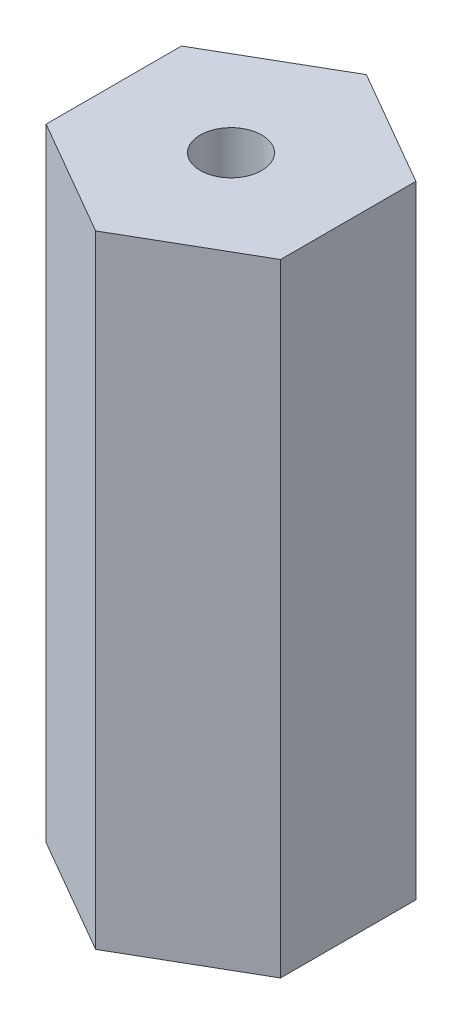
ISO-10303-21;
HEADER;
FILE_DESCRIPTION(('STEP AP214'),'2;1');
FILE_NAME('part.step','',(''),(''),'','','');
FILE_SCHEMA(('AUTOMOTIVE_DESIGN { 1 0 10303 214 1 1 1 1 }'));
ENDSEC;
DATA;
#1=APPLICATION_CONTEXT('core data for automotive mechanical design processes');
#2=APPLICATION_PROTOCOL_DEFINITION('international standard','automotive_design',2000,#1);
#3=PRODUCT_CONTEXT('',#1,'mechanical');
#4=PRODUCT('Part','Part','',(#3));
#5=PRODUCT_RELATED_PRODUCT_CATEGORY('part','',(#4));
#6=PRODUCT_DEFINITION_FORMATION('','',#4);
#7=PRODUCT_DEFINITION_CONTEXT('part definition',#1,'design');
#8=PRODUCT_DEFINITION('design','',#6,#7);
#9=PRODUCT_DEFINITION_SHAPE('','',#8);
#10=(LENGTH_UNIT() NAMED_UNIT(*) SI_UNIT(.MILLI.,.METRE.));
#11=(NAMED_UNIT(*) PLANE_ANGLE_UNIT() SI_UNIT($,.RADIAN.));
#12=(NAMED_UNIT(*) SI_UNIT($,.STERADIAN.) SOLID_ANGLE_UNIT());
#13=UNCERTAINTY_MEASURE_WITH_UNIT(LENGTH_MEASURE(1.E-05),#10,'distance_accuracy_value','');
#14=(GEOMETRIC_REPRESENTATION_CONTEXT(3) GLOBAL_UNCERTAINTY_ASSIGNED_CONTEXT((#13)) GLOBAL_UNIT_ASSIGNED_CONTEXT((#10,
#11,#12)) REPRESENTATION_CONTEXT('',''));
#15=CARTESIAN_POINT('',(0.,0.,0.));
#16=DIRECTION('',(0.,0.,1.));
#17=DIRECTION('',(1.,0.,0.));
#18=AXIS2_PLACEMENT_3D('',#15,#16,#17);
#19=CARTESIAN_POINT('',(2.2606,12.,1.30515801853007));
#20=DIRECTION('',(-1.,0.,0.));
#21=DIRECTION('',(0.,0.,1.));
#22=AXIS2_PLACEMENT_3D('',#19,#20,#21);
#23=PLANE('',#22);
#24=DIRECTION('',(0.,0.,-1.));
#25=VECTOR('',#24,1.);
#26=CARTESIAN_POINT('',(2.2606,0.,1.30515801853007));
#27=LINE('',#26,#25);
#28=CARTESIAN_POINT('',(2.2606,0.,1.30515801853007));
#29=VERTEX_POINT('',#28);
#30=CARTESIAN_POINT('',(2.2606,0.,-1.30515801853007));
#31=VERTEX_POINT('',#30);
#32=EDGE_CURVE('E116',#29,#31,#27,.T.);
#33=ORIENTED_EDGE('',*,*,#32,.T.);
#34=DIRECTION('',(0.,-1.,0.));
#35=VECTOR('',#34,1.);
#36=CARTESIAN_POINT('',(2.2606,12.,-1.30515801853007));
#37=LINE('',#36,#35);
#38=CARTESIAN_POINT('',(2.2606,12.,-1.30515801853007));
#39=VERTEX_POINT('',#38);
#40=EDGE_CURVE('E11',#39,#31,#37,.T.);
#41=ORIENTED_EDGE('',*,*,#40,.F.);
#42=DIRECTION('',(0.,0.,-1.));
#43=VECTOR('',#42,1.);
#44=CARTESIAN_POINT('',(2.2606,12.,1.30515801853007));
#45=LINE('',#44,#43);
#46=CARTESIAN_POINT('',(2.2606,12.,1.30515801853007));
#47=VERTEX_POINT('',#46);
#48=EDGE_CURVE('E127',#47,#39,#45,.T.);
#49=ORIENTED_EDGE('',*,*,#48,.F.);
#50=DIRECTION('',(0.,-1.,0.));
#51=VECTOR('',#50,1.);
#52=CARTESIAN_POINT('',(2.2606,12.,1.30515801853007));
#53=LINE('',#52,#51);
#54=EDGE_CURVE('E112',#47,#29,#53,.T.);
#55=ORIENTED_EDGE('',*,*,#54,.T.);
#56=EDGE_LOOP('',(#33,#41,#49,#55));
#57=FACE_BOUND('',#56,.T.);
#58=ADVANCED_FACE('F32',(#57),#23,.F.);
#59=CARTESIAN_POINT('',(2.2606,12.,-1.30515801853007));
#60=DIRECTION('',(-0.5,0.,0.866025403784438));
#61=DIRECTION('',(0.866025403784439,0.,0.5));
#62=AXIS2_PLACEMENT_3D('',#59,#60,#61);
#63=PLANE('',#62);
#64=DIRECTION('',(-0.866025403784439,0.,-0.5));
#65=VECTOR('',#64,1.);
#66=CARTESIAN_POINT('',(2.2606,0.,-1.30515801853007));
#67=LINE('',#66,#65);
#68=CARTESIAN_POINT('',(0.,0.,-2.61031603706014));
#69=VERTEX_POINT('',#68);
#70=EDGE_CURVE('E119',#31,#69,#67,.T.);
#71=ORIENTED_EDGE('',*,*,#70,.T.);
#72=DIRECTION('',(0.,-1.,0.));
#73=VECTOR('',#72,1.);
#74=CARTESIAN_POINT('',(0.,12.,-2.61031603706014));
#75=LINE('',#74,#73);
#76=CARTESIAN_POINT('',(0.,12.,-2.61031603706014));
#77=VERTEX_POINT('',#76);
#78=EDGE_CURVE('E40',#77,#69,#75,.T.);
#79=ORIENTED_EDGE('',*,*,#78,.F.);
#80=DIRECTION('',(-0.866025403784439,0.,-0.5));
#81=VECTOR('',#80,1.);
#82=CARTESIAN_POINT('',(2.2606,12.,-1.30515801853007));
#83=LINE('',#82,#81);
#84=EDGE_CURVE('E85',#39,#77,#83,.T.);
#85=ORIENTED_EDGE('',*,*,#84,.F.);
#86=ORIENTED_EDGE('',*,*,#40,.T.);
#87=EDGE_LOOP('',(#71,#79,#85,#86));
#88=FACE_BOUND('',#87,.T.);
#89=ADVANCED_FACE('F152',(#88),#63,.F.);
#90=CARTESIAN_POINT('',(0.,12.,-2.61031603706014));
#91=DIRECTION('',(0.5,0.,0.866025403784438));
#92=DIRECTION('',(0.866025403784439,0.,-0.5));
#93=AXIS2_PLACEMENT_3D('',#90,#91,#92);
#94=PLANE('',#93);
#95=DIRECTION('',(-0.866025403784439,0.,0.5));
#96=VECTOR('',#95,1.);
#97=CARTESIAN_POINT('',(0.,0.,-2.61031603706014));
#98=LINE('',#97,#96);
#99=CARTESIAN_POINT('',(-2.2606,0.,-1.30515801853007));
#100=VERTEX_POINT('',#99);
#101=EDGE_CURVE('E122',#69,#100,#98,.T.);
#102=ORIENTED_EDGE('',*,*,#101,.T.);
#103=DIRECTION('',(0.,-1.,0.));
#104=VECTOR('',#103,1.);
#105=CARTESIAN_POINT('',(-2.2606,12.,-1.30515801853007));
#106=LINE('',#105,#104);
#107=CARTESIAN_POINT('',(-2.2606,12.,-1.30515801853007));
#108=VERTEX_POINT('',#107);
#109=EDGE_CURVE('E107',#108,#100,#106,.T.);
#110=ORIENTED_EDGE('',*,*,#109,.F.);
#111=DIRECTION('',(-0.866025403784439,0.,0.5));
#112=VECTOR('',#111,1.);
#113=CARTESIAN_POINT('',(0.,12.,-2.61031603706014));
#114=LINE('',#113,#112);
#115=EDGE_CURVE('E98',#77,#108,#114,.T.);
#116=ORIENTED_EDGE('',*,*,#115,.F.);
#117=ORIENTED_EDGE('',*,*,#78,.T.);
#118=EDGE_LOOP('',(#102,#110,#116,#117));
#119=FACE_BOUND('',#118,.T.);
#120=ADVANCED_FACE('F133',(#119),#94,.F.);
#121=CARTESIAN_POINT('',(-2.2606,12.,-1.30515801853007));
#122=DIRECTION('',(1.,0.,0.));
#123=DIRECTION('',(0.,0.,-1.));
#124=AXIS2_PLACEMENT_3D('',#121,#122,#123);
#125=PLANE('',#124);
#126=DIRECTION('',(0.,0.,1.));
#127=VECTOR('',#126,1.);
#128=CARTESIAN_POINT('',(-2.2606,0.,-1.30515801853007));
#129=LINE('',#128,#127);
#130=CARTESIAN_POINT('',(-2.2606,0.,1.30515801853007));
#131=VERTEX_POINT('',#130);
#132=EDGE_CURVE('E106',#100,#131,#129,.T.);
#133=ORIENTED_EDGE('',*,*,#132,.T.);
#134=DIRECTION('',(0.,-1.,0.));
#135=VECTOR('',#134,1.);
#136=CARTESIAN_POINT('',(-2.2606,12.,1.30515801853007));
#137=LINE('',#136,#135);
#138=CARTESIAN_POINT('',(-2.2606,12.,1.30515801853007));
#139=VERTEX_POINT('',#138);
#140=EDGE_CURVE('E103',#139,#131,#137,.T.);
#141=ORIENTED_EDGE('',*,*,#140,.F.);
#142=DIRECTION('',(0.,0.,1.));
#143=VECTOR('',#142,1.);
#144=CARTESIAN_POINT('',(-2.2606,12.,-1.30515801853007));
#145=LINE('',#144,#143);
#146=EDGE_CURVE('E92',#108,#139,#145,.T.);
#147=ORIENTED_EDGE('',*,*,#146,.F.);
#148=ORIENTED_EDGE('',*,*,#109,.T.);
#149=EDGE_LOOP('',(#133,#141,#147,#148));
#150=FACE_BOUND('',#149,.T.);
#151=ADVANCED_FACE('F104',(#150),#125,.F.);
#152=CARTESIAN_POINT('',(-2.2606,12.,1.30515801853007));
#153=DIRECTION('',(0.5,0.,-0.866025403784438));
#154=DIRECTION('',(-0.866025403784439,0.,-0.5));
#155=AXIS2_PLACEMENT_3D('',#152,#153,#154);
#156=PLANE('',#155);
#157=DIRECTION('',(0.866025403784439,0.,0.5));
#158=VECTOR('',#157,1.);
#159=CARTESIAN_POINT('',(-2.2606,0.,1.30515801853007));
#160=LINE('',#159,#158);
#161=CARTESIAN_POINT('',(0.,0.,2.61031603706014));
#162=VERTEX_POINT('',#161);
#163=EDGE_CURVE('E71',#131,#162,#160,.T.);
#164=ORIENTED_EDGE('',*,*,#163,.T.);
#165=DIRECTION('',(0.,-1.,0.));
#166=VECTOR('',#165,1.);
#167=CARTESIAN_POINT('',(0.,12.,2.61031603706014));
#168=LINE('',#167,#166);
#169=CARTESIAN_POINT('',(0.,12.,2.61031603706014));
#170=VERTEX_POINT('',#169);
#171=EDGE_CURVE('E108',#170,#162,#168,.T.);
#172=ORIENTED_EDGE('',*,*,#171,.F.);
#173=DIRECTION('',(0.866025403784439,0.,0.5));
#174=VECTOR('',#173,1.);
#175=CARTESIAN_POINT('',(-2.2606,12.,1.30515801853007));
#176=LINE('',#175,#174);
#177=EDGE_CURVE('E96',#139,#170,#176,.T.);
#178=ORIENTED_EDGE('',*,*,#177,.F.);
#179=ORIENTED_EDGE('',*,*,#140,.T.);
#180=EDGE_LOOP('',(#164,#172,#178,#179));
#181=FACE_BOUND('',#180,.T.);
#182=ADVANCED_FACE('F110',(#181),#156,.F.);
#183=CARTESIAN_POINT('',(0.,12.,2.61031603706014));
#184=DIRECTION('',(-0.5,0.,-0.866025403784438));
#185=DIRECTION('',(-0.866025403784438,0.,0.5));
#186=AXIS2_PLACEMENT_3D('',#183,#184,#185);
#187=PLANE('',#186);
#188=DIRECTION('',(0.866025403784438,0.,-0.5));
#189=VECTOR('',#188,1.);
#190=CARTESIAN_POINT('',(0.,0.,2.61031603706014));
#191=LINE('',#190,#189);
#192=EDGE_CURVE('E77',#162,#29,#191,.T.);
#193=ORIENTED_EDGE('',*,*,#192,.T.);
#194=ORIENTED_EDGE('',*,*,#54,.F.);
#195=DIRECTION('',(0.866025403784438,0.,-0.5));
#196=VECTOR('',#195,1.);
#197=CARTESIAN_POINT('',(0.,12.,2.61031603706014));
#198=LINE('',#197,#196);
#199=EDGE_CURVE('E48',#170,#47,#198,.T.);
#200=ORIENTED_EDGE('',*,*,#199,.F.);
#201=ORIENTED_EDGE('',*,*,#171,.T.);
#202=EDGE_LOOP('',(#193,#194,#200,#201));
#203=FACE_BOUND('',#202,.T.);
#204=ADVANCED_FACE('F140',(#203),#187,.F.);
#205=CARTESIAN_POINT('',(2.2606,12.,-1.30515801853007));
#206=DIRECTION('',(0.,1.,0.));
#207=DIRECTION('',(0.,0.,1.));
#208=AXIS2_PLACEMENT_3D('',#205,#206,#207);
#209=PLANE('',#208);
#210=CARTESIAN_POINT('',(0.,12.,0.));
#211=DIRECTION('',(0.,1.,0.));
#212=DIRECTION('',(0.,0.,1.));
#213=AXIS2_PLACEMENT_3D('',#210,#211,#212);
#214=CIRCLE('',#213,0.593671867306966);
#215=CARTESIAN_POINT('',(0.,12.,0.593671867306966));
#216=VERTEX_POINT('',#215);
#217=EDGE_CURVE('E207',#216,#216,#214,.T.);
#218=ORIENTED_EDGE('',*,*,#217,.F.);
#219=EDGE_LOOP('',(#218));
#220=FACE_BOUND('',#219,.T.);
#221=ORIENTED_EDGE('',*,*,#48,.T.);
#222=ORIENTED_EDGE('',*,*,#84,.T.);
#223=ORIENTED_EDGE('',*,*,#115,.T.);
#224=ORIENTED_EDGE('',*,*,#146,.T.);
#225=ORIENTED_EDGE('',*,*,#177,.T.);
#226=ORIENTED_EDGE('',*,*,#199,.T.);
#227=EDGE_LOOP('',(#221,#222,#223,#224,#225,#226));
#228=FACE_BOUND('',#227,.T.);
#229=ADVANCED_FACE('F94',(#220,#228),#209,.T.);
#230=CARTESIAN_POINT('',(2.2606,0.,-1.30515801853007));
#231=DIRECTION('',(0.,1.,0.));
#232=DIRECTION('',(0.,0.,1.));
#233=AXIS2_PLACEMENT_3D('',#230,#231,#232);
#234=PLANE('',#233);
#235=CARTESIAN_POINT('',(0.,0.,0.));
#236=DIRECTION('',(0.,1.,0.));
#237=DIRECTION('',(0.,0.,1.));
#238=AXIS2_PLACEMENT_3D('',#235,#236,#237);
#239=CIRCLE('',#238,0.593671867306966);
#240=CARTESIAN_POINT('',(0.,0.,0.593671867306966));
#241=VERTEX_POINT('',#240);
#242=EDGE_CURVE('E120',#241,#241,#239,.T.);
#243=ORIENTED_EDGE('',*,*,#242,.T.);
#244=EDGE_LOOP('',(#243));
#245=FACE_BOUND('',#244,.T.);
#246=ORIENTED_EDGE('',*,*,#32,.F.);
#247=ORIENTED_EDGE('',*,*,#192,.F.);
#248=ORIENTED_EDGE('',*,*,#163,.F.);
#249=ORIENTED_EDGE('',*,*,#132,.F.);
#250=ORIENTED_EDGE('',*,*,#101,.F.);
#251=ORIENTED_EDGE('',*,*,#70,.F.);
#252=EDGE_LOOP('',(#246,#247,#248,#249,#250,#251));
#253=FACE_BOUND('',#252,.T.);
#254=ADVANCED_FACE('F136',(#245,#253),#234,.F.);
#255=CARTESIAN_POINT('',(0.,0.,0.));
#256=DIRECTION('',(0.,1.,0.));
#257=DIRECTION('',(0.,0.,1.));
#258=AXIS2_PLACEMENT_3D('',#255,#256,#257);
#259=CYLINDRICAL_SURFACE('',#258,0.593671867306966);
#260=ORIENTED_EDGE('',*,*,#242,.F.);
#261=EDGE_LOOP('',(#260));
#262=FACE_BOUND('',#261,.T.);
#263=ORIENTED_EDGE('',*,*,#217,.T.);
#264=EDGE_LOOP('',(#263));
#265=FACE_BOUND('',#264,.T.);
#266=ADVANCED_FACE('F189',(#262,#265),#259,.F.);
#267=CLOSED_SHELL('',(#58,#89,#120,#151,#182,#204,#229,#254,#266));
#268=MANIFOLD_SOLID_BREP('B2',#267);
#269=ADVANCED_BREP_SHAPE_REPRESENTATION('',(#18,#268),#14);
#270=SHAPE_DEFINITION_REPRESENTATION(#9,#269);
ENDSEC;
END-ISO-10303-21;
